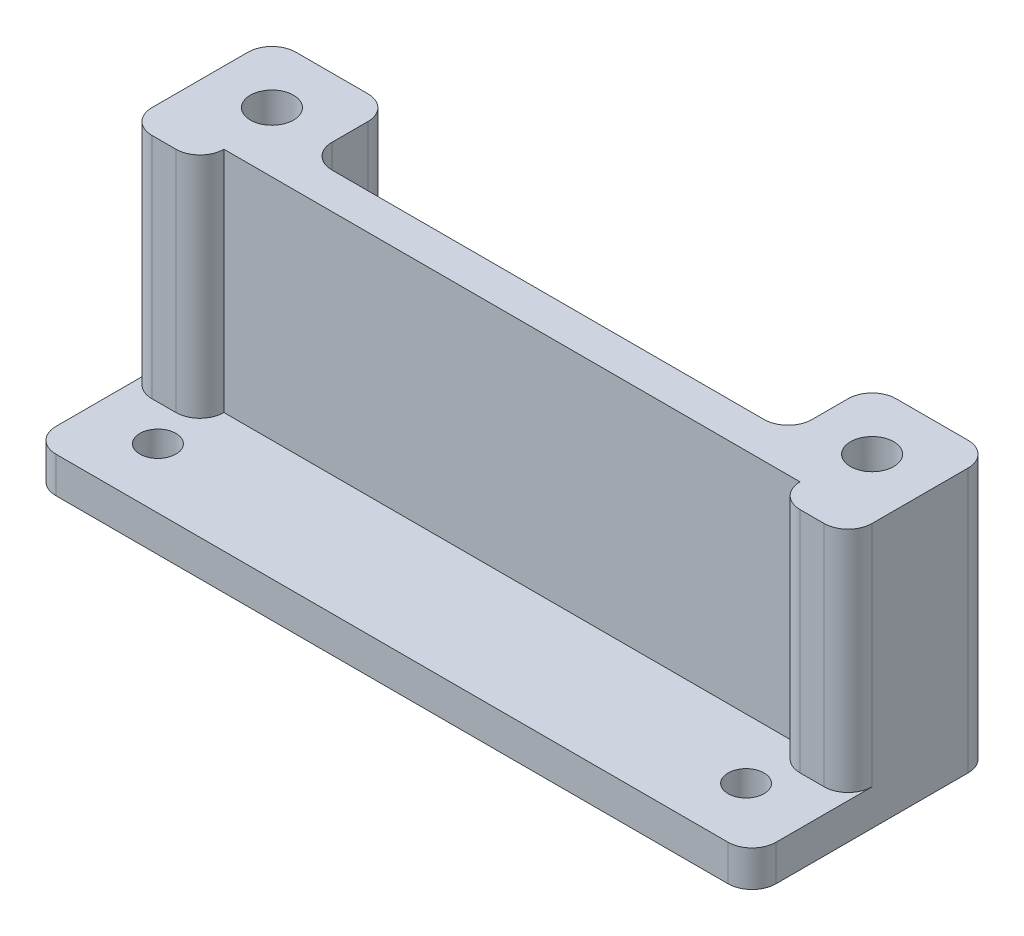
ISO-10303-21;
HEADER;
FILE_DESCRIPTION(('STEP AP214'),'2;1');
FILE_NAME('part.step','',(''),(''),'','','');
FILE_SCHEMA(('AUTOMOTIVE_DESIGN { 1 0 10303 214 1 1 1 1 }'));
ENDSEC;
DATA;
#1=APPLICATION_CONTEXT('core data for automotive mechanical design processes');
#2=APPLICATION_PROTOCOL_DEFINITION('international standard','automotive_design',2000,#1);
#3=PRODUCT_CONTEXT('',#1,'mechanical');
#4=PRODUCT('Part','Part','',(#3));
#5=PRODUCT_RELATED_PRODUCT_CATEGORY('part','',(#4));
#6=PRODUCT_DEFINITION_FORMATION('','',#4);
#7=PRODUCT_DEFINITION_CONTEXT('part definition',#1,'design');
#8=PRODUCT_DEFINITION('design','',#6,#7);
#9=PRODUCT_DEFINITION_SHAPE('','',#8);
#10=(LENGTH_UNIT() NAMED_UNIT(*) SI_UNIT(.MILLI.,.METRE.));
#11=(NAMED_UNIT(*) PLANE_ANGLE_UNIT() SI_UNIT($,.RADIAN.));
#12=(NAMED_UNIT(*) SI_UNIT($,.STERADIAN.) SOLID_ANGLE_UNIT());
#13=UNCERTAINTY_MEASURE_WITH_UNIT(LENGTH_MEASURE(1.E-05),#10,'distance_accuracy_value','');
#14=(GEOMETRIC_REPRESENTATION_CONTEXT(3) GLOBAL_UNCERTAINTY_ASSIGNED_CONTEXT((#13)) GLOBAL_UNIT_ASSIGNED_CONTEXT((#10,
#11,#12)) REPRESENTATION_CONTEXT('',''));
#15=CARTESIAN_POINT('',(0.,0.,0.));
#16=DIRECTION('',(0.,0.,1.));
#17=DIRECTION('',(1.,0.,0.));
#18=AXIS2_PLACEMENT_3D('',#15,#16,#17);
#19=CARTESIAN_POINT('',(-27.6194029850746,3.,6.04477611940299));
#20=DIRECTION('',(0.,0.,1.));
#21=DIRECTION('',(1.,0.,0.));
#22=AXIS2_PLACEMENT_3D('',#19,#20,#21);
#23=PLANE('',#22);
#24=DIRECTION('',(-1.,0.,0.));
#25=VECTOR('',#24,1.);
#26=CARTESIAN_POINT('',(-27.6194029850746,0.,6.04477611940299));
#27=LINE('',#26,#25);
#28=CARTESIAN_POINT('',(30.3805970149254,0.,6.04477611940298));
#29=VERTEX_POINT('',#28);
#30=CARTESIAN_POINT('',(24.3805970149254,0.,6.04477611940298));
#31=VERTEX_POINT('',#30);
#32=EDGE_CURVE('E322',#29,#31,#27,.T.);
#33=ORIENTED_EDGE('',*,*,#32,.T.);
#34=DIRECTION('',(0.,1.,0.));
#35=VECTOR('',#34,1.);
#36=CARTESIAN_POINT('',(24.3805970149254,3.,6.04477611940298));
#37=LINE('',#36,#35);
#38=CARTESIAN_POINT('',(24.3805970149254,22.,6.04477611940298));
#39=VERTEX_POINT('',#38);
#40=EDGE_CURVE('E448',#31,#39,#37,.T.);
#41=ORIENTED_EDGE('',*,*,#40,.T.);
#42=DIRECTION('',(-1.,0.,0.));
#43=VECTOR('',#42,1.);
#44=CARTESIAN_POINT('',(-27.6194029850746,22.,6.04477611940298));
#45=LINE('',#44,#43);
#46=CARTESIAN_POINT('',(30.3805970149254,22.,6.04477611940298));
#47=VERTEX_POINT('',#46);
#48=EDGE_CURVE('E277',#47,#39,#45,.T.);
#49=ORIENTED_EDGE('',*,*,#48,.F.);
#50=DIRECTION('',(0.,-1.,0.));
#51=VECTOR('',#50,1.);
#52=CARTESIAN_POINT('',(30.3805970149254,3.,6.04477611940298));
#53=LINE('',#52,#51);
#54=EDGE_CURVE('E444',#47,#29,#53,.T.);
#55=ORIENTED_EDGE('',*,*,#54,.T.);
#56=EDGE_LOOP('',(#33,#41,#49,#55));
#57=FACE_BOUND('',#56,.T.);
#58=ADVANCED_FACE('F46',(#57),#23,.F.);
#59=CARTESIAN_POINT('',(0.,3.,0.));
#60=DIRECTION('',(0.,1.,0.));
#61=DIRECTION('',(0.,0.,1.));
#62=AXIS2_PLACEMENT_3D('',#59,#60,#61);
#63=PLANE('',#62);
#64=CARTESIAN_POINT('',(-22.1194029850746,3.,21.044776119403));
#65=DIRECTION('',(0.,1.,0.));
#66=DIRECTION('',(0.,0.,1.));
#67=AXIS2_PLACEMENT_3D('',#64,#65,#66);
#68=CIRCLE('',#67,1.5);
#69=CARTESIAN_POINT('',(-22.1194029850746,3.,22.544776119403));
#70=VERTEX_POINT('',#69);
#71=EDGE_CURVE('E296',#70,#70,#68,.T.);
#72=ORIENTED_EDGE('',*,*,#71,.F.);
#73=EDGE_LOOP('',(#72));
#74=FACE_BOUND('',#73,.T.);
#75=CARTESIAN_POINT('',(26.8805970149254,3.,21.044776119403));
#76=DIRECTION('',(0.,1.,0.));
#77=DIRECTION('',(0.,0.,1.));
#78=AXIS2_PLACEMENT_3D('',#75,#76,#77);
#79=CIRCLE('',#78,1.5);
#80=CARTESIAN_POINT('',(26.8805970149254,3.,22.544776119403));
#81=VERTEX_POINT('',#80);
#82=EDGE_CURVE('E288',#81,#81,#79,.T.);
#83=ORIENTED_EDGE('',*,*,#82,.F.);
#84=EDGE_LOOP('',(#83));
#85=FACE_BOUND('',#84,.T.);
#86=DIRECTION('',(0.,0.,1.));
#87=VECTOR('',#86,1.);
#88=CARTESIAN_POINT('',(-27.6194029850746,3.,6.04477611940299));
#89=LINE('',#88,#87);
#90=CARTESIAN_POINT('',(-27.6194029850746,3.,16.044776119403));
#91=VERTEX_POINT('',#90);
#92=CARTESIAN_POINT('',(-27.6194029850746,3.,24.044776119403));
#93=VERTEX_POINT('',#92);
#94=EDGE_CURVE('E307',#91,#93,#89,.T.);
#95=ORIENTED_EDGE('',*,*,#94,.T.);
#96=CARTESIAN_POINT('',(-25.6194029850746,3.,24.044776119403));
#97=DIRECTION('',(0.,1.,0.));
#98=DIRECTION('',(0.,0.,1.));
#99=AXIS2_PLACEMENT_3D('',#96,#97,#98);
#100=CIRCLE('',#99,2.);
#101=CARTESIAN_POINT('',(-25.6194029850746,3.,26.044776119403));
#102=VERTEX_POINT('',#101);
#103=EDGE_CURVE('E436',#93,#102,#100,.T.);
#104=ORIENTED_EDGE('',*,*,#103,.T.);
#105=DIRECTION('',(1.,0.,0.));
#106=VECTOR('',#105,1.);
#107=CARTESIAN_POINT('',(-27.6194029850746,3.,26.044776119403));
#108=LINE('',#107,#106);
#109=CARTESIAN_POINT('',(30.3805970149254,3.,26.044776119403));
#110=VERTEX_POINT('',#109);
#111=EDGE_CURVE('E311',#102,#110,#108,.T.);
#112=ORIENTED_EDGE('',*,*,#111,.T.);
#113=CARTESIAN_POINT('',(30.3805970149254,3.,24.044776119403));
#114=DIRECTION('',(0.,1.,0.));
#115=DIRECTION('',(0.,0.,1.));
#116=AXIS2_PLACEMENT_3D('',#113,#114,#115);
#117=CIRCLE('',#116,2.);
#118=CARTESIAN_POINT('',(32.3805970149254,3.,24.044776119403));
#119=VERTEX_POINT('',#118);
#120=EDGE_CURVE('E433',#110,#119,#117,.T.);
#121=ORIENTED_EDGE('',*,*,#120,.T.);
#122=DIRECTION('',(0.,0.,-1.));
#123=VECTOR('',#122,1.);
#124=CARTESIAN_POINT('',(32.3805970149254,3.,6.04477611940298));
#125=LINE('',#124,#123);
#126=CARTESIAN_POINT('',(32.3805970149254,3.,16.044776119403));
#127=VERTEX_POINT('',#126);
#128=EDGE_CURVE('E304',#119,#127,#125,.T.);
#129=ORIENTED_EDGE('',*,*,#128,.T.);
#130=CARTESIAN_POINT('',(30.3805970149254,3.,16.044776119403));
#131=DIRECTION('',(0.,1.,0.));
#132=DIRECTION('',(0.,0.,1.));
#133=AXIS2_PLACEMENT_3D('',#130,#131,#132);
#134=CIRCLE('',#133,2.);
#135=CARTESIAN_POINT('',(30.3805970149254,3.,18.044776119403));
#136=VERTEX_POINT('',#135);
#137=EDGE_CURVE('E55',#127,#136,#134,.F.);
#138=ORIENTED_EDGE('',*,*,#137,.T.);
#139=DIRECTION('',(1.,0.,0.));
#140=VECTOR('',#139,1.);
#141=CARTESIAN_POINT('',(32.3805970149254,3.,18.044776119403));
#142=LINE('',#141,#140);
#143=CARTESIAN_POINT('',(28.3805970149254,3.,18.044776119403));
#144=VERTEX_POINT('',#143);
#145=EDGE_CURVE('E216',#144,#136,#142,.T.);
#146=ORIENTED_EDGE('',*,*,#145,.F.);
#147=CARTESIAN_POINT('',(28.3805970149254,3.,16.044776119403));
#148=DIRECTION('',(0.,1.,0.));
#149=DIRECTION('',(0.,0.,1.));
#150=AXIS2_PLACEMENT_3D('',#147,#148,#149);
#151=CIRCLE('',#150,2.);
#152=CARTESIAN_POINT('',(26.3805970149254,3.,16.044776119403));
#153=VERTEX_POINT('',#152);
#154=EDGE_CURVE('E209',#144,#153,#151,.F.);
#155=ORIENTED_EDGE('',*,*,#154,.T.);
#156=DIRECTION('',(1.,0.,0.));
#157=VECTOR('',#156,1.);
#158=CARTESIAN_POINT('',(-27.6194029850746,3.,16.044776119403));
#159=LINE('',#158,#157);
#160=CARTESIAN_POINT('',(-21.6194029850746,3.,16.044776119403));
#161=VERTEX_POINT('',#160);
#162=EDGE_CURVE('E213',#161,#153,#159,.T.);
#163=ORIENTED_EDGE('',*,*,#162,.F.);
#164=CARTESIAN_POINT('',(-23.6194029850746,3.,16.044776119403));
#165=DIRECTION('',(0.,1.,0.));
#166=DIRECTION('',(0.,0.,1.));
#167=AXIS2_PLACEMENT_3D('',#164,#165,#166);
#168=CIRCLE('',#167,2.);
#169=CARTESIAN_POINT('',(-23.6194029850746,3.,18.044776119403));
#170=VERTEX_POINT('',#169);
#171=EDGE_CURVE('E222',#161,#170,#168,.F.);
#172=ORIENTED_EDGE('',*,*,#171,.T.);
#173=DIRECTION('',(1.,0.,0.));
#174=VECTOR('',#173,1.);
#175=CARTESIAN_POINT('',(-27.6194029850746,3.,18.044776119403));
#176=LINE('',#175,#174);
#177=CARTESIAN_POINT('',(-25.6194029850746,3.,18.044776119403));
#178=VERTEX_POINT('',#177);
#179=EDGE_CURVE('E245',#178,#170,#176,.T.);
#180=ORIENTED_EDGE('',*,*,#179,.F.);
#181=CARTESIAN_POINT('',(-25.6194029850746,3.,16.044776119403));
#182=DIRECTION('',(0.,1.,0.));
#183=DIRECTION('',(0.,0.,1.));
#184=AXIS2_PLACEMENT_3D('',#181,#182,#183);
#185=CIRCLE('',#184,2.);
#186=EDGE_CURVE('E11',#178,#91,#185,.F.);
#187=ORIENTED_EDGE('',*,*,#186,.T.);
#188=EDGE_LOOP('',(#95,#104,#112,#121,#129,#138,#146,#155,#163,#172,#180,#187));
#189=FACE_BOUND('',#188,.T.);
#190=ADVANCED_FACE('F212',(#74,#85,#189),#63,.T.);
#191=CARTESIAN_POINT('',(-27.6194029850746,22.,16.044776119403));
#192=DIRECTION('',(0.,0.,-1.));
#193=DIRECTION('',(-1.,0.,0.));
#194=AXIS2_PLACEMENT_3D('',#191,#192,#193);
#195=PLANE('',#194);
#196=DIRECTION('',(0.,-1.,0.));
#197=VECTOR('',#196,1.);
#198=CARTESIAN_POINT('',(26.3805970149254,22.,16.044776119403));
#199=LINE('',#198,#197);
#200=CARTESIAN_POINT('',(26.3805970149254,22.,16.044776119403));
#201=VERTEX_POINT('',#200);
#202=EDGE_CURVE('E227',#201,#153,#199,.T.);
#203=ORIENTED_EDGE('',*,*,#202,.F.);
#204=DIRECTION('',(1.,0.,0.));
#205=VECTOR('',#204,1.);
#206=CARTESIAN_POINT('',(-27.6194029850746,22.,16.044776119403));
#207=LINE('',#206,#205);
#208=CARTESIAN_POINT('',(-21.6194029850746,22.,16.044776119403));
#209=VERTEX_POINT('',#208);
#210=EDGE_CURVE('E267',#209,#201,#207,.T.);
#211=ORIENTED_EDGE('',*,*,#210,.F.);
#212=DIRECTION('',(0.,1.,0.));
#213=VECTOR('',#212,1.);
#214=CARTESIAN_POINT('',(-21.6194029850746,22.,16.044776119403));
#215=LINE('',#214,#213);
#216=EDGE_CURVE('E230',#161,#209,#215,.T.);
#217=ORIENTED_EDGE('',*,*,#216,.F.);
#218=ORIENTED_EDGE('',*,*,#162,.T.);
#219=EDGE_LOOP('',(#203,#211,#217,#218));
#220=FACE_BOUND('',#219,.T.);
#221=ADVANCED_FACE('F225',(#220),#195,.F.);
#222=CARTESIAN_POINT('',(0.,0.,0.));
#223=DIRECTION('',(0.,1.,0.));
#224=DIRECTION('',(0.,0.,1.));
#225=AXIS2_PLACEMENT_3D('',#222,#223,#224);
#226=PLANE('',#225);
#227=DIRECTION('',(1.,0.,0.));
#228=VECTOR('',#227,1.);
#229=CARTESIAN_POINT('',(-27.6194029850746,0.,26.044776119403));
#230=LINE('',#229,#228);
#231=CARTESIAN_POINT('',(-25.6194029850746,0.,26.044776119403));
#232=VERTEX_POINT('',#231);
#233=CARTESIAN_POINT('',(30.3805970149254,0.,26.044776119403));
#234=VERTEX_POINT('',#233);
#235=EDGE_CURVE('E308',#232,#234,#230,.T.);
#236=ORIENTED_EDGE('',*,*,#235,.F.);
#237=CARTESIAN_POINT('',(-25.6194029850746,0.,24.044776119403));
#238=DIRECTION('',(0.,1.,0.));
#239=DIRECTION('',(0.,0.,1.));
#240=AXIS2_PLACEMENT_3D('',#237,#238,#239);
#241=CIRCLE('',#240,2.);
#242=CARTESIAN_POINT('',(-27.6194029850746,0.,24.044776119403));
#243=VERTEX_POINT('',#242);
#244=EDGE_CURVE('E430',#232,#243,#241,.F.);
#245=ORIENTED_EDGE('',*,*,#244,.T.);
#246=DIRECTION('',(0.,0.,1.));
#247=VECTOR('',#246,1.);
#248=CARTESIAN_POINT('',(-27.6194029850746,0.,6.04477611940299));
#249=LINE('',#248,#247);
#250=CARTESIAN_POINT('',(-27.6194029850746,0.,8.04477611940299));
#251=VERTEX_POINT('',#250);
#252=EDGE_CURVE('E323',#251,#243,#249,.T.);
#253=ORIENTED_EDGE('',*,*,#252,.F.);
#254=CARTESIAN_POINT('',(-25.6194029850746,0.,8.04477611940299));
#255=DIRECTION('',(0.,1.,0.));
#256=DIRECTION('',(0.,0.,1.));
#257=AXIS2_PLACEMENT_3D('',#254,#255,#256);
#258=CIRCLE('',#257,2.);
#259=CARTESIAN_POINT('',(-25.6194029850746,0.,6.04477611940299));
#260=VERTEX_POINT('',#259);
#261=EDGE_CURVE('E62',#251,#260,#258,.F.);
#262=ORIENTED_EDGE('',*,*,#261,.T.);
#263=CARTESIAN_POINT('',(-19.6194029850746,0.,6.04477611940298));
#264=VERTEX_POINT('',#263);
#265=EDGE_CURVE('E319',#264,#260,#27,.T.);
#266=ORIENTED_EDGE('',*,*,#265,.F.);
#267=CARTESIAN_POINT('',(-19.6194029850746,0.,8.04477611940298));
#268=DIRECTION('',(0.,1.,0.));
#269=DIRECTION('',(0.,0.,1.));
#270=AXIS2_PLACEMENT_3D('',#267,#268,#269);
#271=CIRCLE('',#270,2.);
#272=CARTESIAN_POINT('',(-17.6194029850746,0.,8.04477611940298));
#273=VERTEX_POINT('',#272);
#274=EDGE_CURVE('E422',#264,#273,#271,.F.);
#275=ORIENTED_EDGE('',*,*,#274,.T.);
#276=DIRECTION('',(0.,0.,1.));
#277=VECTOR('',#276,1.);
#278=CARTESIAN_POINT('',(-17.6194029850746,0.,6.04477611940298));
#279=LINE('',#278,#277);
#280=CARTESIAN_POINT('',(-17.6194029850746,0.,11.044776119403));
#281=VERTEX_POINT('',#280);
#282=EDGE_CURVE('E524',#273,#281,#279,.T.);
#283=ORIENTED_EDGE('',*,*,#282,.T.);
#284=CARTESIAN_POINT('',(-15.6194029850746,0.,11.044776119403));
#285=DIRECTION('',(0.,1.,0.));
#286=DIRECTION('',(0.,0.,1.));
#287=AXIS2_PLACEMENT_3D('',#284,#285,#286);
#288=CIRCLE('',#287,2.);
#289=CARTESIAN_POINT('',(-15.6194029850746,0.,13.044776119403));
#290=VERTEX_POINT('',#289);
#291=EDGE_CURVE('E455',#281,#290,#288,.T.);
#292=ORIENTED_EDGE('',*,*,#291,.T.);
#293=DIRECTION('',(1.,0.,0.));
#294=VECTOR('',#293,1.);
#295=CARTESIAN_POINT('',(-17.6194029850746,0.,13.044776119403));
#296=LINE('',#295,#294);
#297=CARTESIAN_POINT('',(20.3805970149254,0.,13.044776119403));
#298=VERTEX_POINT('',#297);
#299=EDGE_CURVE('E253',#290,#298,#296,.T.);
#300=ORIENTED_EDGE('',*,*,#299,.T.);
#301=CARTESIAN_POINT('',(20.3805970149254,0.,11.044776119403));
#302=DIRECTION('',(0.,1.,0.));
#303=DIRECTION('',(0.,0.,1.));
#304=AXIS2_PLACEMENT_3D('',#301,#302,#303);
#305=CIRCLE('',#304,2.);
#306=CARTESIAN_POINT('',(22.3805970149254,0.,11.044776119403));
#307=VERTEX_POINT('',#306);
#308=EDGE_CURVE('E461',#298,#307,#305,.T.);
#309=ORIENTED_EDGE('',*,*,#308,.T.);
#310=DIRECTION('',(0.,0.,-1.));
#311=VECTOR('',#310,1.);
#312=CARTESIAN_POINT('',(22.3805970149254,0.,6.04477611940298));
#313=LINE('',#312,#311);
#314=CARTESIAN_POINT('',(22.3805970149254,0.,8.04477611940298));
#315=VERTEX_POINT('',#314);
#316=EDGE_CURVE('E519',#307,#315,#313,.T.);
#317=ORIENTED_EDGE('',*,*,#316,.T.);
#318=CARTESIAN_POINT('',(24.3805970149254,0.,8.04477611940298));
#319=DIRECTION('',(0.,1.,0.));
#320=DIRECTION('',(0.,0.,1.));
#321=AXIS2_PLACEMENT_3D('',#318,#319,#320);
#322=CIRCLE('',#321,2.);
#323=EDGE_CURVE('E419',#315,#31,#322,.F.);
#324=ORIENTED_EDGE('',*,*,#323,.T.);
#325=ORIENTED_EDGE('',*,*,#32,.F.);
#326=CARTESIAN_POINT('',(30.3805970149254,0.,8.04477611940298));
#327=DIRECTION('',(0.,1.,0.));
#328=DIRECTION('',(0.,0.,1.));
#329=AXIS2_PLACEMENT_3D('',#326,#327,#328);
#330=CIRCLE('',#329,2.);
#331=CARTESIAN_POINT('',(32.3805970149254,0.,8.04477611940298));
#332=VERTEX_POINT('',#331);
#333=EDGE_CURVE('E416',#29,#332,#330,.F.);
#334=ORIENTED_EDGE('',*,*,#333,.T.);
#335=DIRECTION('',(0.,0.,-1.));
#336=VECTOR('',#335,1.);
#337=CARTESIAN_POINT('',(32.3805970149254,0.,6.04477611940298));
#338=LINE('',#337,#336);
#339=CARTESIAN_POINT('',(32.3805970149254,0.,24.044776119403));
#340=VERTEX_POINT('',#339);
#341=EDGE_CURVE('E300',#340,#332,#338,.T.);
#342=ORIENTED_EDGE('',*,*,#341,.F.);
#343=CARTESIAN_POINT('',(30.3805970149254,0.,24.044776119403));
#344=DIRECTION('',(0.,1.,0.));
#345=DIRECTION('',(0.,0.,1.));
#346=AXIS2_PLACEMENT_3D('',#343,#344,#345);
#347=CIRCLE('',#346,2.);
#348=EDGE_CURVE('E427',#340,#234,#347,.F.);
#349=ORIENTED_EDGE('',*,*,#348,.T.);
#350=EDGE_LOOP('',(#236,#245,#253,#262,#266,#275,#283,#292,#300,#309,#317,#324,#325,#334,#342,#349));
#351=FACE_BOUND('',#350,.T.);
#352=CARTESIAN_POINT('',(-22.1194029850746,0.,21.044776119403));
#353=DIRECTION('',(0.,1.,0.));
#354=DIRECTION('',(0.,0.,1.));
#355=AXIS2_PLACEMENT_3D('',#352,#353,#354);
#356=CIRCLE('',#355,1.5);
#357=CARTESIAN_POINT('',(-22.1194029850746,0.,22.544776119403));
#358=VERTEX_POINT('',#357);
#359=EDGE_CURVE('E292',#358,#358,#356,.T.);
#360=ORIENTED_EDGE('',*,*,#359,.T.);
#361=EDGE_LOOP('',(#360));
#362=FACE_BOUND('',#361,.T.);
#363=CARTESIAN_POINT('',(26.8805970149254,0.,21.044776119403));
#364=DIRECTION('',(0.,1.,0.));
#365=DIRECTION('',(0.,0.,1.));
#366=AXIS2_PLACEMENT_3D('',#363,#364,#365);
#367=CIRCLE('',#366,1.5);
#368=CARTESIAN_POINT('',(26.8805970149254,0.,22.544776119403));
#369=VERTEX_POINT('',#368);
#370=EDGE_CURVE('E287',#369,#369,#367,.T.);
#371=ORIENTED_EDGE('',*,*,#370,.T.);
#372=EDGE_LOOP('',(#371));
#373=FACE_BOUND('',#372,.T.);
#374=CARTESIAN_POINT('',(-22.6194029850746,0.,11.044776119403));
#375=DIRECTION('',(0.,1.,0.));
#376=DIRECTION('',(0.,0.,1.));
#377=AXIS2_PLACEMENT_3D('',#374,#375,#376);
#378=CIRCLE('',#377,1.8);
#379=CARTESIAN_POINT('',(-22.6194029850746,0.,12.844776119403));
#380=VERTEX_POINT('',#379);
#381=EDGE_CURVE('E283',#380,#380,#378,.T.);
#382=ORIENTED_EDGE('',*,*,#381,.T.);
#383=EDGE_LOOP('',(#382));
#384=FACE_BOUND('',#383,.T.);
#385=CARTESIAN_POINT('',(27.3805970149254,0.,11.044776119403));
#386=DIRECTION('',(0.,1.,0.));
#387=DIRECTION('',(0.,0.,1.));
#388=AXIS2_PLACEMENT_3D('',#385,#386,#387);
#389=CIRCLE('',#388,1.8);
#390=CARTESIAN_POINT('',(27.3805970149254,0.,12.844776119403));
#391=VERTEX_POINT('',#390);
#392=EDGE_CURVE('E279',#391,#391,#389,.T.);
#393=ORIENTED_EDGE('',*,*,#392,.T.);
#394=EDGE_LOOP('',(#393));
#395=FACE_BOUND('',#394,.T.);
#396=ADVANCED_FACE('F535',(#351,#362,#373,#384,#395),#226,.F.);
#397=CARTESIAN_POINT('',(32.3805970149254,3.,6.04477611940298));
#398=DIRECTION('',(-1.,0.,0.));
#399=DIRECTION('',(0.,0.,1.));
#400=AXIS2_PLACEMENT_3D('',#397,#398,#399);
#401=PLANE('',#400);
#402=DIRECTION('',(0.,0.,-1.));
#403=VECTOR('',#402,1.);
#404=CARTESIAN_POINT('',(32.3805970149254,22.,16.044776119403));
#405=LINE('',#404,#403);
#406=CARTESIAN_POINT('',(32.3805970149254,22.,16.044776119403));
#407=VERTEX_POINT('',#406);
#408=CARTESIAN_POINT('',(32.3805970149254,22.,8.04477611940298));
#409=VERTEX_POINT('',#408);
#410=EDGE_CURVE('E270',#407,#409,#405,.T.);
#411=ORIENTED_EDGE('',*,*,#410,.F.);
#412=DIRECTION('',(0.,1.,0.));
#413=VECTOR('',#412,1.);
#414=CARTESIAN_POINT('',(32.3805970149254,3.,16.044776119403));
#415=LINE('',#414,#413);
#416=EDGE_CURVE('E395',#407,#127,#415,.F.);
#417=ORIENTED_EDGE('',*,*,#416,.T.);
#418=ORIENTED_EDGE('',*,*,#128,.F.);
#419=DIRECTION('',(0.,-1.,0.));
#420=VECTOR('',#419,1.);
#421=CARTESIAN_POINT('',(32.3805970149254,3.,24.044776119403));
#422=LINE('',#421,#420);
#423=EDGE_CURVE('E391',#119,#340,#422,.T.);
#424=ORIENTED_EDGE('',*,*,#423,.T.);
#425=ORIENTED_EDGE('',*,*,#341,.T.);
#426=DIRECTION('',(0.,-1.,0.));
#427=VECTOR('',#426,1.);
#428=CARTESIAN_POINT('',(32.3805970149254,3.,8.04477611940298));
#429=LINE('',#428,#427);
#430=EDGE_CURVE('E388',#332,#409,#429,.F.);
#431=ORIENTED_EDGE('',*,*,#430,.T.);
#432=EDGE_LOOP('',(#411,#417,#418,#424,#425,#431));
#433=FACE_BOUND('',#432,.T.);
#434=ADVANCED_FACE('F482',(#433),#401,.F.);
#435=ORIENTED_EDGE('',*,*,#265,.T.);
#436=DIRECTION('',(0.,-1.,0.));
#437=VECTOR('',#436,1.);
#438=CARTESIAN_POINT('',(-25.6194029850746,3.,6.04477611940299));
#439=LINE('',#438,#437);
#440=CARTESIAN_POINT('',(-25.6194029850746,22.,6.04477611940298));
#441=VERTEX_POINT('',#440);
#442=EDGE_CURVE('E441',#260,#441,#439,.F.);
#443=ORIENTED_EDGE('',*,*,#442,.T.);
#444=CARTESIAN_POINT('',(-19.6194029850746,22.,6.04477611940298));
#445=VERTEX_POINT('',#444);
#446=EDGE_CURVE('E274',#445,#441,#45,.T.);
#447=ORIENTED_EDGE('',*,*,#446,.F.);
#448=DIRECTION('',(0.,1.,0.));
#449=VECTOR('',#448,1.);
#450=CARTESIAN_POINT('',(-19.6194029850746,3.,6.04477611940298));
#451=LINE('',#450,#449);
#452=EDGE_CURVE('E69',#445,#264,#451,.F.);
#453=ORIENTED_EDGE('',*,*,#452,.T.);
#454=EDGE_LOOP('',(#435,#443,#447,#453));
#455=FACE_BOUND('',#454,.T.);
#456=ADVANCED_FACE('F558',(#455),#23,.F.);
#457=CARTESIAN_POINT('',(-27.6194029850746,3.,6.04477611940299));
#458=DIRECTION('',(1.,0.,0.));
#459=DIRECTION('',(0.,0.,-1.));
#460=AXIS2_PLACEMENT_3D('',#457,#458,#459);
#461=PLANE('',#460);
#462=ORIENTED_EDGE('',*,*,#94,.F.);
#463=DIRECTION('',(0.,-1.,0.));
#464=VECTOR('',#463,1.);
#465=CARTESIAN_POINT('',(-27.6194029850746,22.,16.044776119403));
#466=LINE('',#465,#464);
#467=CARTESIAN_POINT('',(-27.6194029850746,22.,16.044776119403));
#468=VERTEX_POINT('',#467);
#469=EDGE_CURVE('E406',#91,#468,#466,.F.);
#470=ORIENTED_EDGE('',*,*,#469,.T.);
#471=DIRECTION('',(0.,0.,1.));
#472=VECTOR('',#471,1.);
#473=CARTESIAN_POINT('',(-27.6194029850746,22.,16.044776119403));
#474=LINE('',#473,#472);
#475=CARTESIAN_POINT('',(-27.6194029850746,22.,8.04477611940299));
#476=VERTEX_POINT('',#475);
#477=EDGE_CURVE('E232',#476,#468,#474,.T.);
#478=ORIENTED_EDGE('',*,*,#477,.F.);
#479=DIRECTION('',(0.,-1.,0.));
#480=VECTOR('',#479,1.);
#481=CARTESIAN_POINT('',(-27.6194029850746,3.,8.04477611940299));
#482=LINE('',#481,#480);
#483=EDGE_CURVE('E399',#476,#251,#482,.T.);
#484=ORIENTED_EDGE('',*,*,#483,.T.);
#485=ORIENTED_EDGE('',*,*,#252,.T.);
#486=DIRECTION('',(0.,-1.,0.));
#487=VECTOR('',#486,1.);
#488=CARTESIAN_POINT('',(-27.6194029850746,3.,24.044776119403));
#489=LINE('',#488,#487);
#490=EDGE_CURVE('E403',#243,#93,#489,.F.);
#491=ORIENTED_EDGE('',*,*,#490,.T.);
#492=EDGE_LOOP('',(#462,#470,#478,#484,#485,#491));
#493=FACE_BOUND('',#492,.T.);
#494=ADVANCED_FACE('F568',(#493),#461,.F.);
#495=CARTESIAN_POINT('',(-27.6194029850746,3.,26.044776119403));
#496=DIRECTION('',(0.,0.,-1.));
#497=DIRECTION('',(-1.,0.,0.));
#498=AXIS2_PLACEMENT_3D('',#495,#496,#497);
#499=PLANE('',#498);
#500=ORIENTED_EDGE('',*,*,#111,.F.);
#501=DIRECTION('',(0.,-1.,0.));
#502=VECTOR('',#501,1.);
#503=CARTESIAN_POINT('',(-25.6194029850746,3.,26.044776119403));
#504=LINE('',#503,#502);
#505=EDGE_CURVE('E412',#102,#232,#504,.T.);
#506=ORIENTED_EDGE('',*,*,#505,.T.);
#507=ORIENTED_EDGE('',*,*,#235,.T.);
#508=DIRECTION('',(0.,-1.,0.));
#509=VECTOR('',#508,1.);
#510=CARTESIAN_POINT('',(30.3805970149254,3.,26.044776119403));
#511=LINE('',#510,#509);
#512=EDGE_CURVE('E409',#234,#110,#511,.F.);
#513=ORIENTED_EDGE('',*,*,#512,.T.);
#514=EDGE_LOOP('',(#500,#506,#507,#513));
#515=FACE_BOUND('',#514,.T.);
#516=ADVANCED_FACE('F573',(#515),#499,.F.);
#517=CARTESIAN_POINT('',(-22.1194029850746,3.,21.044776119403));
#518=DIRECTION('',(0.,-1.,0.));
#519=DIRECTION('',(0.,0.,-1.));
#520=AXIS2_PLACEMENT_3D('',#517,#518,#519);
#521=CYLINDRICAL_SURFACE('',#520,1.5);
#522=ORIENTED_EDGE('',*,*,#71,.T.);
#523=EDGE_LOOP('',(#522));
#524=FACE_BOUND('',#523,.T.);
#525=ORIENTED_EDGE('',*,*,#359,.F.);
#526=EDGE_LOOP('',(#525));
#527=FACE_BOUND('',#526,.T.);
#528=ADVANCED_FACE('F788',(#524,#527),#521,.F.);
#529=CARTESIAN_POINT('',(26.8805970149254,3.,21.044776119403));
#530=DIRECTION('',(0.,-1.,0.));
#531=DIRECTION('',(0.,0.,-1.));
#532=AXIS2_PLACEMENT_3D('',#529,#530,#531);
#533=CYLINDRICAL_SURFACE('',#532,1.5);
#534=ORIENTED_EDGE('',*,*,#82,.T.);
#535=EDGE_LOOP('',(#534));
#536=FACE_BOUND('',#535,.T.);
#537=ORIENTED_EDGE('',*,*,#370,.F.);
#538=EDGE_LOOP('',(#537));
#539=FACE_BOUND('',#538,.T.);
#540=ADVANCED_FACE('F779',(#536,#539),#533,.F.);
#541=CARTESIAN_POINT('',(-22.6194029850746,3.,11.044776119403));
#542=DIRECTION('',(0.,-1.,0.));
#543=DIRECTION('',(0.,0.,-1.));
#544=AXIS2_PLACEMENT_3D('',#541,#542,#543);
#545=CYLINDRICAL_SURFACE('',#544,1.8);
#546=ORIENTED_EDGE('',*,*,#381,.F.);
#547=EDGE_LOOP('',(#546));
#548=FACE_BOUND('',#547,.T.);
#549=CARTESIAN_POINT('',(-22.6194029850746,22.,11.044776119403));
#550=DIRECTION('',(0.,-1.,0.));
#551=DIRECTION('',(0.,0.,-1.));
#552=AXIS2_PLACEMENT_3D('',#549,#550,#551);
#553=CIRCLE('',#552,1.8);
#554=CARTESIAN_POINT('',(-22.6194029850746,22.,9.24477611940298));
#555=VERTEX_POINT('',#554);
#556=EDGE_CURVE('E260',#555,#555,#553,.T.);
#557=ORIENTED_EDGE('',*,*,#556,.F.);
#558=EDGE_LOOP('',(#557));
#559=FACE_BOUND('',#558,.T.);
#560=ADVANCED_FACE('F769',(#548,#559),#545,.F.);
#561=CARTESIAN_POINT('',(27.3805970149254,3.,11.044776119403));
#562=DIRECTION('',(0.,-1.,0.));
#563=DIRECTION('',(0.,0.,-1.));
#564=AXIS2_PLACEMENT_3D('',#561,#562,#563);
#565=CYLINDRICAL_SURFACE('',#564,1.8);
#566=ORIENTED_EDGE('',*,*,#392,.F.);
#567=EDGE_LOOP('',(#566));
#568=FACE_BOUND('',#567,.T.);
#569=CARTESIAN_POINT('',(27.3805970149254,22.,11.044776119403));
#570=DIRECTION('',(0.,-1.,0.));
#571=DIRECTION('',(0.,0.,-1.));
#572=AXIS2_PLACEMENT_3D('',#569,#570,#571);
#573=CIRCLE('',#572,1.8);
#574=CARTESIAN_POINT('',(27.3805970149254,22.,9.24477611940298));
#575=VERTEX_POINT('',#574);
#576=EDGE_CURVE('E233',#575,#575,#573,.T.);
#577=ORIENTED_EDGE('',*,*,#576,.F.);
#578=EDGE_LOOP('',(#577));
#579=FACE_BOUND('',#578,.T.);
#580=ADVANCED_FACE('F758',(#568,#579),#565,.F.);
#581=CARTESIAN_POINT('',(0.,22.,0.));
#582=DIRECTION('',(0.,-1.,0.));
#583=DIRECTION('',(0.,0.,-1.));
#584=AXIS2_PLACEMENT_3D('',#581,#582,#583);
#585=PLANE('',#584);
#586=ORIENTED_EDGE('',*,*,#576,.T.);
#587=EDGE_LOOP('',(#586));
#588=FACE_BOUND('',#587,.T.);
#589=ORIENTED_EDGE('',*,*,#556,.T.);
#590=EDGE_LOOP('',(#589));
#591=FACE_BOUND('',#590,.T.);
#592=DIRECTION('',(-1.,0.,0.));
#593=VECTOR('',#592,1.);
#594=CARTESIAN_POINT('',(-27.6194029850746,22.,18.044776119403));
#595=LINE('',#594,#593);
#596=CARTESIAN_POINT('',(-23.6194029850746,22.,18.044776119403));
#597=VERTEX_POINT('',#596);
#598=CARTESIAN_POINT('',(-25.6194029850746,22.,18.044776119403));
#599=VERTEX_POINT('',#598);
#600=EDGE_CURVE('E249',#597,#599,#595,.T.);
#601=ORIENTED_EDGE('',*,*,#600,.F.);
#602=CARTESIAN_POINT('',(-23.6194029850746,22.,16.044776119403));
#603=DIRECTION('',(0.,-1.,0.));
#604=DIRECTION('',(0.,0.,-1.));
#605=AXIS2_PLACEMENT_3D('',#602,#603,#604);
#606=CIRCLE('',#605,2.);
#607=EDGE_CURVE('E378',#597,#209,#606,.F.);
#608=ORIENTED_EDGE('',*,*,#607,.T.);
#609=ORIENTED_EDGE('',*,*,#210,.T.);
#610=CARTESIAN_POINT('',(28.3805970149254,22.,16.044776119403));
#611=DIRECTION('',(0.,-1.,0.));
#612=DIRECTION('',(0.,0.,-1.));
#613=AXIS2_PLACEMENT_3D('',#610,#611,#612);
#614=CIRCLE('',#613,2.);
#615=CARTESIAN_POINT('',(28.3805970149254,22.,18.044776119403));
#616=VERTEX_POINT('',#615);
#617=EDGE_CURVE('E237',#201,#616,#614,.F.);
#618=ORIENTED_EDGE('',*,*,#617,.T.);
#619=DIRECTION('',(-1.,0.,0.));
#620=VECTOR('',#619,1.);
#621=CARTESIAN_POINT('',(32.3805970149254,22.,18.044776119403));
#622=LINE('',#621,#620);
#623=CARTESIAN_POINT('',(30.3805970149254,22.,18.044776119403));
#624=VERTEX_POINT('',#623);
#625=EDGE_CURVE('E239',#624,#616,#622,.T.);
#626=ORIENTED_EDGE('',*,*,#625,.F.);
#627=CARTESIAN_POINT('',(30.3805970149254,22.,16.044776119403));
#628=DIRECTION('',(0.,-1.,0.));
#629=DIRECTION('',(0.,0.,-1.));
#630=AXIS2_PLACEMENT_3D('',#627,#628,#629);
#631=CIRCLE('',#630,2.);
#632=EDGE_CURVE('E373',#624,#407,#631,.F.);
#633=ORIENTED_EDGE('',*,*,#632,.T.);
#634=ORIENTED_EDGE('',*,*,#410,.T.);
#635=CARTESIAN_POINT('',(30.3805970149254,22.,8.04477611940298));
#636=DIRECTION('',(0.,-1.,0.));
#637=DIRECTION('',(0.,0.,-1.));
#638=AXIS2_PLACEMENT_3D('',#635,#636,#637);
#639=CIRCLE('',#638,2.);
#640=EDGE_CURVE('E358',#409,#47,#639,.F.);
#641=ORIENTED_EDGE('',*,*,#640,.T.);
#642=ORIENTED_EDGE('',*,*,#48,.T.);
#643=CARTESIAN_POINT('',(24.3805970149254,22.,8.04477611940298));
#644=DIRECTION('',(0.,-1.,0.));
#645=DIRECTION('',(0.,0.,-1.));
#646=AXIS2_PLACEMENT_3D('',#643,#644,#645);
#647=CIRCLE('',#646,2.);
#648=CARTESIAN_POINT('',(22.3805970149254,22.,8.04477611940298));
#649=VERTEX_POINT('',#648);
#650=EDGE_CURVE('E361',#39,#649,#647,.F.);
#651=ORIENTED_EDGE('',*,*,#650,.T.);
#652=DIRECTION('',(0.,0.,-1.));
#653=VECTOR('',#652,1.);
#654=CARTESIAN_POINT('',(22.3805970149254,22.,6.04477611940298));
#655=LINE('',#654,#653);
#656=CARTESIAN_POINT('',(22.3805970149254,22.,11.044776119403));
#657=VERTEX_POINT('',#656);
#658=EDGE_CURVE('E501',#657,#649,#655,.T.);
#659=ORIENTED_EDGE('',*,*,#658,.F.);
#660=CARTESIAN_POINT('',(20.3805970149254,22.,11.044776119403));
#661=DIRECTION('',(0.,-1.,0.));
#662=DIRECTION('',(0.,0.,-1.));
#663=AXIS2_PLACEMENT_3D('',#660,#661,#662);
#664=CIRCLE('',#663,2.);
#665=CARTESIAN_POINT('',(20.3805970149254,22.,13.044776119403));
#666=VERTEX_POINT('',#665);
#667=EDGE_CURVE('E458',#657,#666,#664,.T.);
#668=ORIENTED_EDGE('',*,*,#667,.T.);
#669=DIRECTION('',(1.,0.,0.));
#670=VECTOR('',#669,1.);
#671=CARTESIAN_POINT('',(-17.6194029850746,22.,13.044776119403));
#672=LINE('',#671,#670);
#673=CARTESIAN_POINT('',(-15.6194029850746,22.,13.044776119403));
#674=VERTEX_POINT('',#673);
#675=EDGE_CURVE('E512',#674,#666,#672,.T.);
#676=ORIENTED_EDGE('',*,*,#675,.F.);
#677=CARTESIAN_POINT('',(-15.6194029850746,22.,11.044776119403));
#678=DIRECTION('',(0.,-1.,0.));
#679=DIRECTION('',(0.,0.,-1.));
#680=AXIS2_PLACEMENT_3D('',#677,#678,#679);
#681=CIRCLE('',#680,2.);
#682=CARTESIAN_POINT('',(-17.6194029850746,22.,11.044776119403));
#683=VERTEX_POINT('',#682);
#684=EDGE_CURVE('E452',#674,#683,#681,.T.);
#685=ORIENTED_EDGE('',*,*,#684,.T.);
#686=DIRECTION('',(0.,0.,1.));
#687=VECTOR('',#686,1.);
#688=CARTESIAN_POINT('',(-17.6194029850746,22.,6.04477611940298));
#689=LINE('',#688,#687);
#690=CARTESIAN_POINT('',(-17.6194029850746,22.,8.04477611940298));
#691=VERTEX_POINT('',#690);
#692=EDGE_CURVE('E508',#691,#683,#689,.T.);
#693=ORIENTED_EDGE('',*,*,#692,.F.);
#694=CARTESIAN_POINT('',(-19.6194029850746,22.,8.04477611940298));
#695=DIRECTION('',(0.,-1.,0.));
#696=DIRECTION('',(0.,0.,-1.));
#697=AXIS2_PLACEMENT_3D('',#694,#695,#696);
#698=CIRCLE('',#697,2.);
#699=EDGE_CURVE('E364',#691,#445,#698,.F.);
#700=ORIENTED_EDGE('',*,*,#699,.T.);
#701=ORIENTED_EDGE('',*,*,#446,.T.);
#702=CARTESIAN_POINT('',(-25.6194029850746,22.,8.04477611940299));
#703=DIRECTION('',(0.,-1.,0.));
#704=DIRECTION('',(0.,0.,-1.));
#705=AXIS2_PLACEMENT_3D('',#702,#703,#704);
#706=CIRCLE('',#705,2.);
#707=EDGE_CURVE('E367',#441,#476,#706,.F.);
#708=ORIENTED_EDGE('',*,*,#707,.T.);
#709=ORIENTED_EDGE('',*,*,#477,.T.);
#710=CARTESIAN_POINT('',(-25.6194029850746,22.,16.044776119403));
#711=DIRECTION('',(0.,-1.,0.));
#712=DIRECTION('',(0.,0.,-1.));
#713=AXIS2_PLACEMENT_3D('',#710,#711,#712);
#714=CIRCLE('',#713,2.);
#715=EDGE_CURVE('E370',#468,#599,#714,.F.);
#716=ORIENTED_EDGE('',*,*,#715,.T.);
#717=EDGE_LOOP('',(#601,#608,#609,#618,#626,#633,#634,#641,#642,#651,#659,#668,#676,#685,#693,
#700,#701,#708,#709,#716));
#718=FACE_BOUND('',#717,.T.);
#719=ADVANCED_FACE('F479',(#588,#591,#718),#585,.F.);
#720=CARTESIAN_POINT('',(0.,0.,18.044776119403));
#721=DIRECTION('',(0.,0.,1.));
#722=DIRECTION('',(1.,0.,0.));
#723=AXIS2_PLACEMENT_3D('',#720,#721,#722);
#724=PLANE('',#723);
#725=ORIENTED_EDGE('',*,*,#179,.T.);
#726=DIRECTION('',(0.,1.,0.));
#727=VECTOR('',#726,1.);
#728=CARTESIAN_POINT('',(-23.6194029850746,22.,18.044776119403));
#729=LINE('',#728,#727);
#730=EDGE_CURVE('E354',#170,#597,#729,.T.);
#731=ORIENTED_EDGE('',*,*,#730,.T.);
#732=ORIENTED_EDGE('',*,*,#600,.T.);
#733=DIRECTION('',(0.,-1.,0.));
#734=VECTOR('',#733,1.);
#735=CARTESIAN_POINT('',(-25.6194029850746,3.,18.044776119403));
#736=LINE('',#735,#734);
#737=EDGE_CURVE('E350',#599,#178,#736,.T.);
#738=ORIENTED_EDGE('',*,*,#737,.T.);
#739=EDGE_LOOP('',(#725,#731,#732,#738));
#740=FACE_BOUND('',#739,.T.);
#741=ADVANCED_FACE('F588',(#740),#724,.T.);
#742=CARTESIAN_POINT('',(0.,0.,18.044776119403));
#743=DIRECTION('',(0.,0.,-1.));
#744=DIRECTION('',(-1.,0.,0.));
#745=AXIS2_PLACEMENT_3D('',#742,#743,#744);
#746=PLANE('',#745);
#747=ORIENTED_EDGE('',*,*,#625,.T.);
#748=DIRECTION('',(0.,-1.,0.));
#749=VECTOR('',#748,1.);
#750=CARTESIAN_POINT('',(28.3805970149254,0.,18.044776119403));
#751=LINE('',#750,#749);
#752=EDGE_CURVE('E385',#616,#144,#751,.T.);
#753=ORIENTED_EDGE('',*,*,#752,.T.);
#754=ORIENTED_EDGE('',*,*,#145,.T.);
#755=DIRECTION('',(0.,1.,0.));
#756=VECTOR('',#755,1.);
#757=CARTESIAN_POINT('',(30.3805970149254,0.,18.044776119403));
#758=LINE('',#757,#756);
#759=EDGE_CURVE('E381',#136,#624,#758,.T.);
#760=ORIENTED_EDGE('',*,*,#759,.T.);
#761=EDGE_LOOP('',(#747,#753,#754,#760));
#762=FACE_BOUND('',#761,.T.);
#763=ADVANCED_FACE('F472',(#762),#746,.F.);
#764=CARTESIAN_POINT('',(22.3805970149254,0.,6.04477611940298));
#765=DIRECTION('',(1.,0.,0.));
#766=DIRECTION('',(0.,0.,-1.));
#767=AXIS2_PLACEMENT_3D('',#764,#765,#766);
#768=PLANE('',#767);
#769=ORIENTED_EDGE('',*,*,#316,.F.);
#770=DIRECTION('',(0.,1.,0.));
#771=VECTOR('',#770,1.);
#772=CARTESIAN_POINT('',(22.3805970149254,22.,11.044776119403));
#773=LINE('',#772,#771);
#774=EDGE_CURVE('E346',#307,#657,#773,.T.);
#775=ORIENTED_EDGE('',*,*,#774,.T.);
#776=ORIENTED_EDGE('',*,*,#658,.T.);
#777=DIRECTION('',(0.,1.,0.));
#778=VECTOR('',#777,1.);
#779=CARTESIAN_POINT('',(22.3805970149254,0.,8.04477611940298));
#780=LINE('',#779,#778);
#781=EDGE_CURVE('E343',#649,#315,#780,.F.);
#782=ORIENTED_EDGE('',*,*,#781,.T.);
#783=EDGE_LOOP('',(#769,#775,#776,#782));
#784=FACE_BOUND('',#783,.T.);
#785=ADVANCED_FACE('F504',(#784),#768,.F.);
#786=CARTESIAN_POINT('',(-17.6194029850746,0.,13.044776119403));
#787=DIRECTION('',(0.,0.,1.));
#788=DIRECTION('',(1.,0.,0.));
#789=AXIS2_PLACEMENT_3D('',#786,#787,#788);
#790=PLANE('',#789);
#791=ORIENTED_EDGE('',*,*,#299,.F.);
#792=DIRECTION('',(0.,1.,0.));
#793=VECTOR('',#792,1.);
#794=CARTESIAN_POINT('',(-15.6194029850746,22.,13.044776119403));
#795=LINE('',#794,#793);
#796=EDGE_CURVE('E332',#290,#674,#795,.T.);
#797=ORIENTED_EDGE('',*,*,#796,.T.);
#798=ORIENTED_EDGE('',*,*,#675,.T.);
#799=DIRECTION('',(0.,1.,0.));
#800=VECTOR('',#799,1.);
#801=CARTESIAN_POINT('',(20.3805970149254,0.,13.044776119403));
#802=LINE('',#801,#800);
#803=EDGE_CURVE('E315',#666,#298,#802,.F.);
#804=ORIENTED_EDGE('',*,*,#803,.T.);
#805=EDGE_LOOP('',(#791,#797,#798,#804));
#806=FACE_BOUND('',#805,.T.);
#807=ADVANCED_FACE('F547',(#806),#790,.F.);
#808=CARTESIAN_POINT('',(-17.6194029850746,0.,6.04477611940298));
#809=DIRECTION('',(-1.,0.,0.));
#810=DIRECTION('',(0.,0.,1.));
#811=AXIS2_PLACEMENT_3D('',#808,#809,#810);
#812=PLANE('',#811);
#813=ORIENTED_EDGE('',*,*,#692,.T.);
#814=DIRECTION('',(0.,1.,0.));
#815=VECTOR('',#814,1.);
#816=CARTESIAN_POINT('',(-17.6194029850746,0.,11.044776119403));
#817=LINE('',#816,#815);
#818=EDGE_CURVE('E340',#683,#281,#817,.F.);
#819=ORIENTED_EDGE('',*,*,#818,.T.);
#820=ORIENTED_EDGE('',*,*,#282,.F.);
#821=DIRECTION('',(0.,1.,0.));
#822=VECTOR('',#821,1.);
#823=CARTESIAN_POINT('',(-17.6194029850746,0.,8.04477611940298));
#824=LINE('',#823,#822);
#825=EDGE_CURVE('E336',#273,#691,#824,.T.);
#826=ORIENTED_EDGE('',*,*,#825,.T.);
#827=EDGE_LOOP('',(#813,#819,#820,#826));
#828=FACE_BOUND('',#827,.T.);
#829=ADVANCED_FACE('F544',(#828),#812,.F.);
#830=CARTESIAN_POINT('',(-15.6194029850746,0.,11.044776119403));
#831=DIRECTION('',(0.,-1.,0.));
#832=DIRECTION('',(0.,0.,-1.));
#833=AXIS2_PLACEMENT_3D('',#830,#831,#832);
#834=CYLINDRICAL_SURFACE('',#833,2.);
#835=ORIENTED_EDGE('',*,*,#291,.F.);
#836=ORIENTED_EDGE('',*,*,#818,.F.);
#837=ORIENTED_EDGE('',*,*,#684,.F.);
#838=ORIENTED_EDGE('',*,*,#796,.F.);
#839=EDGE_LOOP('',(#835,#836,#837,#838));
#840=FACE_BOUND('',#839,.T.);
#841=ADVANCED_FACE('F546',(#840),#834,.F.);
#842=CARTESIAN_POINT('',(20.3805970149254,0.,11.044776119403));
#843=DIRECTION('',(0.,-1.,0.));
#844=DIRECTION('',(0.,0.,-1.));
#845=AXIS2_PLACEMENT_3D('',#842,#843,#844);
#846=CYLINDRICAL_SURFACE('',#845,2.);
#847=ORIENTED_EDGE('',*,*,#308,.F.);
#848=ORIENTED_EDGE('',*,*,#803,.F.);
#849=ORIENTED_EDGE('',*,*,#667,.F.);
#850=ORIENTED_EDGE('',*,*,#774,.F.);
#851=EDGE_LOOP('',(#847,#848,#849,#850));
#852=FACE_BOUND('',#851,.T.);
#853=ADVANCED_FACE('F539',(#852),#846,.F.);
#854=CARTESIAN_POINT('',(-23.6194029850746,0.,16.044776119403));
#855=DIRECTION('',(0.,-1.,0.));
#856=DIRECTION('',(1.,0.,0.));
#857=AXIS2_PLACEMENT_3D('',#854,#855,#856);
#858=CYLINDRICAL_SURFACE('',#857,2.);
#859=ORIENTED_EDGE('',*,*,#171,.F.);
#860=ORIENTED_EDGE('',*,*,#216,.T.);
#861=ORIENTED_EDGE('',*,*,#607,.F.);
#862=ORIENTED_EDGE('',*,*,#730,.F.);
#863=EDGE_LOOP('',(#859,#860,#861,#862));
#864=FACE_BOUND('',#863,.T.);
#865=ADVANCED_FACE('F592',(#864),#858,.T.);
#866=CARTESIAN_POINT('',(28.3805970149254,0.,16.044776119403));
#867=DIRECTION('',(0.,-1.,0.));
#868=DIRECTION('',(0.,0.,-1.));
#869=AXIS2_PLACEMENT_3D('',#866,#867,#868);
#870=CYLINDRICAL_SURFACE('',#869,2.);
#871=ORIENTED_EDGE('',*,*,#617,.F.);
#872=ORIENTED_EDGE('',*,*,#202,.T.);
#873=ORIENTED_EDGE('',*,*,#154,.F.);
#874=ORIENTED_EDGE('',*,*,#752,.F.);
#875=EDGE_LOOP('',(#871,#872,#873,#874));
#876=FACE_BOUND('',#875,.T.);
#877=ADVANCED_FACE('F236',(#876),#870,.T.);
#878=CARTESIAN_POINT('',(30.3805970149254,0.,16.044776119403));
#879=DIRECTION('',(0.,1.,0.));
#880=DIRECTION('',(0.,0.,1.));
#881=AXIS2_PLACEMENT_3D('',#878,#879,#880);
#882=CYLINDRICAL_SURFACE('',#881,2.);
#883=ORIENTED_EDGE('',*,*,#137,.F.);
#884=ORIENTED_EDGE('',*,*,#416,.F.);
#885=ORIENTED_EDGE('',*,*,#632,.F.);
#886=ORIENTED_EDGE('',*,*,#759,.F.);
#887=EDGE_LOOP('',(#883,#884,#885,#886));
#888=FACE_BOUND('',#887,.T.);
#889=ADVANCED_FACE('F475',(#888),#882,.T.);
#890=CARTESIAN_POINT('',(-25.6194029850746,0.,16.044776119403));
#891=DIRECTION('',(0.,1.,0.));
#892=DIRECTION('',(0.,0.,1.));
#893=AXIS2_PLACEMENT_3D('',#890,#891,#892);
#894=CYLINDRICAL_SURFACE('',#893,2.);
#895=ORIENTED_EDGE('',*,*,#715,.F.);
#896=ORIENTED_EDGE('',*,*,#469,.F.);
#897=ORIENTED_EDGE('',*,*,#186,.F.);
#898=ORIENTED_EDGE('',*,*,#737,.F.);
#899=EDGE_LOOP('',(#895,#896,#897,#898));
#900=FACE_BOUND('',#899,.T.);
#901=ADVANCED_FACE('F585',(#900),#894,.T.);
#902=CARTESIAN_POINT('',(-25.6194029850746,3.,24.044776119403));
#903=DIRECTION('',(0.,-1.,0.));
#904=DIRECTION('',(0.,0.,-1.));
#905=AXIS2_PLACEMENT_3D('',#902,#903,#904);
#906=CYLINDRICAL_SURFACE('',#905,2.);
#907=ORIENTED_EDGE('',*,*,#103,.F.);
#908=ORIENTED_EDGE('',*,*,#490,.F.);
#909=ORIENTED_EDGE('',*,*,#244,.F.);
#910=ORIENTED_EDGE('',*,*,#505,.F.);
#911=EDGE_LOOP('',(#907,#908,#909,#910));
#912=FACE_BOUND('',#911,.T.);
#913=ADVANCED_FACE('F598',(#912),#906,.T.);
#914=CARTESIAN_POINT('',(30.3805970149254,3.,24.044776119403));
#915=DIRECTION('',(0.,-1.,0.));
#916=DIRECTION('',(0.,0.,-1.));
#917=AXIS2_PLACEMENT_3D('',#914,#915,#916);
#918=CYLINDRICAL_SURFACE('',#917,2.);
#919=ORIENTED_EDGE('',*,*,#120,.F.);
#920=ORIENTED_EDGE('',*,*,#512,.F.);
#921=ORIENTED_EDGE('',*,*,#348,.F.);
#922=ORIENTED_EDGE('',*,*,#423,.F.);
#923=EDGE_LOOP('',(#919,#920,#921,#922));
#924=FACE_BOUND('',#923,.T.);
#925=ADVANCED_FACE('F604',(#924),#918,.T.);
#926=CARTESIAN_POINT('',(-25.6194029850746,3.,8.04477611940299));
#927=DIRECTION('',(0.,-1.,0.));
#928=DIRECTION('',(0.,0.,-1.));
#929=AXIS2_PLACEMENT_3D('',#926,#927,#928);
#930=CYLINDRICAL_SURFACE('',#929,2.);
#931=ORIENTED_EDGE('',*,*,#707,.F.);
#932=ORIENTED_EDGE('',*,*,#442,.F.);
#933=ORIENTED_EDGE('',*,*,#261,.F.);
#934=ORIENTED_EDGE('',*,*,#483,.F.);
#935=EDGE_LOOP('',(#931,#932,#933,#934));
#936=FACE_BOUND('',#935,.T.);
#937=ADVANCED_FACE('F579',(#936),#930,.T.);
#938=CARTESIAN_POINT('',(-19.6194029850746,0.,8.04477611940298));
#939=DIRECTION('',(0.,1.,0.));
#940=DIRECTION('',(0.,0.,1.));
#941=AXIS2_PLACEMENT_3D('',#938,#939,#940);
#942=CYLINDRICAL_SURFACE('',#941,2.);
#943=ORIENTED_EDGE('',*,*,#274,.F.);
#944=ORIENTED_EDGE('',*,*,#452,.F.);
#945=ORIENTED_EDGE('',*,*,#699,.F.);
#946=ORIENTED_EDGE('',*,*,#825,.F.);
#947=EDGE_LOOP('',(#943,#944,#945,#946));
#948=FACE_BOUND('',#947,.T.);
#949=ADVANCED_FACE('F611',(#948),#942,.T.);
#950=CARTESIAN_POINT('',(24.3805970149254,3.,8.04477611940298));
#951=DIRECTION('',(0.,1.,0.));
#952=DIRECTION('',(0.,0.,1.));
#953=AXIS2_PLACEMENT_3D('',#950,#951,#952);
#954=CYLINDRICAL_SURFACE('',#953,2.);
#955=ORIENTED_EDGE('',*,*,#323,.F.);
#956=ORIENTED_EDGE('',*,*,#781,.F.);
#957=ORIENTED_EDGE('',*,*,#650,.F.);
#958=ORIENTED_EDGE('',*,*,#40,.F.);
#959=EDGE_LOOP('',(#955,#956,#957,#958));
#960=FACE_BOUND('',#959,.T.);
#961=ADVANCED_FACE('F497',(#960),#954,.T.);
#962=CARTESIAN_POINT('',(30.3805970149254,3.,8.04477611940298));
#963=DIRECTION('',(0.,-1.,0.));
#964=DIRECTION('',(0.,0.,-1.));
#965=AXIS2_PLACEMENT_3D('',#962,#963,#964);
#966=CYLINDRICAL_SURFACE('',#965,2.);
#967=ORIENTED_EDGE('',*,*,#640,.F.);
#968=ORIENTED_EDGE('',*,*,#430,.F.);
#969=ORIENTED_EDGE('',*,*,#333,.F.);
#970=ORIENTED_EDGE('',*,*,#54,.F.);
#971=EDGE_LOOP('',(#967,#968,#969,#970));
#972=FACE_BOUND('',#971,.T.);
#973=ADVANCED_FACE('F48',(#972),#966,.T.);
#974=CLOSED_SHELL('',(#58,#190,#221,#396,#434,#456,#494,#516,#528,#540,#560,#580,#719,#741,#763,
#785,#807,#829,#841,#853,#865,#877,#889,#901,#913,#925,#937,#949,#961,#973));
#975=MANIFOLD_SOLID_BREP('B2',#974);
#976=ADVANCED_BREP_SHAPE_REPRESENTATION('',(#18,#975),#14);
#977=SHAPE_DEFINITION_REPRESENTATION(#9,#976);
ENDSEC;
END-ISO-10303-21;
